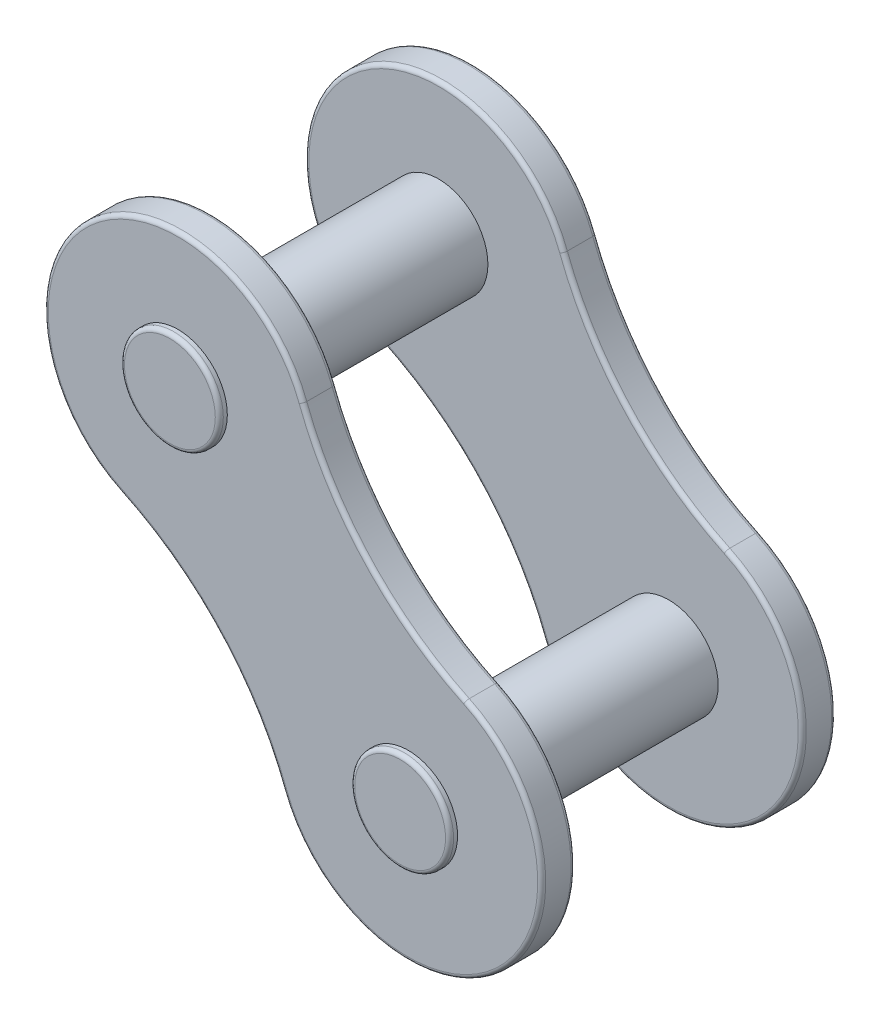
ISO-10303-21;
HEADER;
FILE_DESCRIPTION(('STEP AP214'),'2;1');
FILE_NAME('part.step','',(''),(''),'','','');
FILE_SCHEMA(('AUTOMOTIVE_DESIGN { 1 0 10303 214 1 1 1 1 }'));
ENDSEC;
DATA;
#1=APPLICATION_CONTEXT('core data for automotive mechanical design processes');
#2=APPLICATION_PROTOCOL_DEFINITION('international standard','automotive_design',2000,#1);
#3=PRODUCT_CONTEXT('',#1,'mechanical');
#4=PRODUCT('Part','Part','',(#3));
#5=PRODUCT_RELATED_PRODUCT_CATEGORY('part','',(#4));
#6=PRODUCT_DEFINITION_FORMATION('','',#4);
#7=PRODUCT_DEFINITION_CONTEXT('part definition',#1,'design');
#8=PRODUCT_DEFINITION('design','',#6,#7);
#9=PRODUCT_DEFINITION_SHAPE('','',#8);
#10=(LENGTH_UNIT() NAMED_UNIT(*) SI_UNIT(.MILLI.,.METRE.));
#11=(NAMED_UNIT(*) PLANE_ANGLE_UNIT() SI_UNIT($,.RADIAN.));
#12=(NAMED_UNIT(*) SI_UNIT($,.STERADIAN.) SOLID_ANGLE_UNIT());
#13=UNCERTAINTY_MEASURE_WITH_UNIT(LENGTH_MEASURE(1.E-05),#10,'distance_accuracy_value','');
#14=(GEOMETRIC_REPRESENTATION_CONTEXT(3) GLOBAL_UNCERTAINTY_ASSIGNED_CONTEXT((#13)) GLOBAL_UNIT_ASSIGNED_CONTEXT((#10,
#11,#12)) REPRESENTATION_CONTEXT('',''));
#15=CARTESIAN_POINT('',(0.,0.,0.));
#16=DIRECTION('',(0.,0.,1.));
#17=DIRECTION('',(1.,0.,0.));
#18=AXIS2_PLACEMENT_3D('',#15,#16,#17);
#19=CARTESIAN_POINT('',(26.9319694595818,-25.4507928486215,5.5));
#20=DIRECTION('',(0.,0.,1.));
#21=DIRECTION('',(1.,0.,0.));
#22=AXIS2_PLACEMENT_3D('',#19,#20,#21);
#23=PLANE('',#22);
#24=CARTESIAN_POINT('',(23.2925043090767,-33.1322180691296,5.5));
#25=DIRECTION('',(0.,0.,1.));
#26=DIRECTION('',(1.,0.,0.));
#27=AXIS2_PLACEMENT_3D('',#24,#25,#26);
#28=CIRCLE('',#27,12.15);
#29=CARTESIAN_POINT('',(28.4947986124458,-22.1522984892268,5.5));
#30=VERTEX_POINT('',#29);
#31=CARTESIAN_POINT('',(34.6520311444618,-28.8213422792041,5.5));
#32=VERTEX_POINT('',#31);
#33=EDGE_CURVE('E245',#30,#32,#28,.F.);
#34=ORIENTED_EDGE('',*,*,#33,.T.);
#35=CARTESIAN_POINT('',(39.1864924738131,-27.1005400091516,5.5));
#36=DIRECTION('',(0.,0.,1.));
#37=DIRECTION('',(1.,0.,0.));
#38=AXIS2_PLACEMENT_3D('',#35,#36,#37);
#39=CIRCLE('',#38,4.85);
#40=CARTESIAN_POINT('',(41.2631284714542,-22.7176091480381,5.5));
#41=VERTEX_POINT('',#40);
#42=EDGE_CURVE('E248',#32,#41,#39,.T.);
#43=ORIENTED_EDGE('',*,*,#42,.T.);
#44=CARTESIAN_POINT('',(46.4654227748233,-11.7376895681353,5.5));
#45=DIRECTION('',(0.,0.,1.));
#46=DIRECTION('',(1.,0.,0.));
#47=AXIS2_PLACEMENT_3D('',#44,#45,#46);
#48=CIRCLE('',#47,12.15);
#49=CARTESIAN_POINT('',(35.1058959394382,-16.0485653580608,5.5));
#50=VERTEX_POINT('',#49);
#51=EDGE_CURVE('E239',#41,#50,#48,.F.);
#52=ORIENTED_EDGE('',*,*,#51,.T.);
#53=CARTESIAN_POINT('',(30.571434610087,-17.7693676281133,5.5));
#54=DIRECTION('',(0.,0.,1.));
#55=DIRECTION('',(1.,0.,0.));
#56=AXIS2_PLACEMENT_3D('',#53,#54,#55);
#57=CIRCLE('',#56,4.85);
#58=EDGE_CURVE('E242',#50,#30,#57,.T.);
#59=ORIENTED_EDGE('',*,*,#58,.T.);
#60=EDGE_LOOP('',(#34,#43,#52,#59));
#61=FACE_BOUND('',#60,.T.);
#62=CARTESIAN_POINT('',(30.571434610087,-17.7693676281133,5.5));
#63=DIRECTION('',(0.,0.,1.));
#64=DIRECTION('',(1.,0.,0.));
#65=AXIS2_PLACEMENT_3D('',#62,#63,#64);
#66=CIRCLE('',#65,1.85);
#67=CARTESIAN_POINT('',(32.421434610087,-17.7693676281133,5.5));
#68=VERTEX_POINT('',#67);
#69=EDGE_CURVE('E406',#68,#68,#66,.T.);
#70=ORIENTED_EDGE('',*,*,#69,.F.);
#71=EDGE_LOOP('',(#70));
#72=FACE_BOUND('',#71,.T.);
#73=CARTESIAN_POINT('',(39.1864924738131,-27.1005400091516,5.5));
#74=DIRECTION('',(0.,0.,1.));
#75=DIRECTION('',(1.,0.,0.));
#76=AXIS2_PLACEMENT_3D('',#73,#74,#75);
#77=CIRCLE('',#76,1.85);
#78=CARTESIAN_POINT('',(41.0364924738131,-27.1005400091516,5.5));
#79=VERTEX_POINT('',#78);
#80=EDGE_CURVE('E429',#79,#79,#77,.T.);
#81=ORIENTED_EDGE('',*,*,#80,.F.);
#82=EDGE_LOOP('',(#81));
#83=FACE_BOUND('',#82,.T.);
#84=ADVANCED_FACE('F41',(#61,#72,#83),#23,.T.);
#85=CARTESIAN_POINT('',(26.9319694595818,-25.4507928486215,4.25));
#86=DIRECTION('',(0.,0.,1.));
#87=DIRECTION('',(1.,0.,0.));
#88=AXIS2_PLACEMENT_3D('',#85,#86,#87);
#89=PLANE('',#88);
#90=CARTESIAN_POINT('',(46.4654227748233,-11.7376895681353,4.25));
#91=DIRECTION('',(0.,0.,1.));
#92=DIRECTION('',(1.,0.,0.));
#93=AXIS2_PLACEMENT_3D('',#90,#91,#92);
#94=CIRCLE('',#93,12.15);
#95=CARTESIAN_POINT('',(35.1058959394382,-16.0485653580608,4.25));
#96=VERTEX_POINT('',#95);
#97=CARTESIAN_POINT('',(41.2631284714542,-22.7176091480381,4.25));
#98=VERTEX_POINT('',#97);
#99=EDGE_CURVE('E272',#96,#98,#94,.T.);
#100=ORIENTED_EDGE('',*,*,#99,.T.);
#101=CARTESIAN_POINT('',(39.1864924738131,-27.1005400091516,4.25));
#102=DIRECTION('',(0.,0.,1.));
#103=DIRECTION('',(1.,0.,0.));
#104=AXIS2_PLACEMENT_3D('',#101,#102,#103);
#105=CIRCLE('',#104,4.85);
#106=CARTESIAN_POINT('',(34.6520311444618,-28.8213422792041,4.25));
#107=VERTEX_POINT('',#106);
#108=EDGE_CURVE('E280',#98,#107,#105,.F.);
#109=ORIENTED_EDGE('',*,*,#108,.T.);
#110=CARTESIAN_POINT('',(23.2925043090767,-33.1322180691296,4.25));
#111=DIRECTION('',(0.,0.,1.));
#112=DIRECTION('',(1.,0.,0.));
#113=AXIS2_PLACEMENT_3D('',#110,#111,#112);
#114=CIRCLE('',#113,12.15);
#115=CARTESIAN_POINT('',(28.4947986124458,-22.1522984892268,4.25));
#116=VERTEX_POINT('',#115);
#117=EDGE_CURVE('E66',#107,#116,#114,.T.);
#118=ORIENTED_EDGE('',*,*,#117,.T.);
#119=CARTESIAN_POINT('',(30.571434610087,-17.7693676281133,4.25));
#120=DIRECTION('',(0.,0.,1.));
#121=DIRECTION('',(1.,0.,0.));
#122=AXIS2_PLACEMENT_3D('',#119,#120,#121);
#123=CIRCLE('',#122,4.85);
#124=EDGE_CURVE('E275',#116,#96,#123,.F.);
#125=ORIENTED_EDGE('',*,*,#124,.T.);
#126=EDGE_LOOP('',(#100,#109,#118,#125));
#127=FACE_BOUND('',#126,.T.);
#128=CARTESIAN_POINT('',(30.571434610087,-17.7693676281133,4.25));
#129=DIRECTION('',(0.,0.,1.));
#130=DIRECTION('',(1.,0.,0.));
#131=AXIS2_PLACEMENT_3D('',#128,#129,#130);
#132=CIRCLE('',#131,1.85);
#133=CARTESIAN_POINT('',(32.421434610087,-17.7693676281133,4.25));
#134=VERTEX_POINT('',#133);
#135=EDGE_CURVE('E482',#134,#134,#132,.T.);
#136=ORIENTED_EDGE('',*,*,#135,.T.);
#137=EDGE_LOOP('',(#136));
#138=FACE_BOUND('',#137,.T.);
#139=CARTESIAN_POINT('',(39.1864924738131,-27.1005400091516,4.25));
#140=DIRECTION('',(0.,0.,1.));
#141=DIRECTION('',(1.,0.,0.));
#142=AXIS2_PLACEMENT_3D('',#139,#140,#141);
#143=CIRCLE('',#142,1.85);
#144=CARTESIAN_POINT('',(41.0364924738131,-27.1005400091516,4.25));
#145=VERTEX_POINT('',#144);
#146=EDGE_CURVE('E426',#145,#145,#143,.T.);
#147=ORIENTED_EDGE('',*,*,#146,.T.);
#148=EDGE_LOOP('',(#147));
#149=FACE_BOUND('',#148,.T.);
#150=ADVANCED_FACE('F380',(#127,#138,#149),#89,.F.);
#151=CARTESIAN_POINT('',(30.571434610087,-17.7693676281133,5.5));
#152=DIRECTION('',(0.,0.,-1.));
#153=DIRECTION('',(-1.,0.,0.));
#154=AXIS2_PLACEMENT_3D('',#151,#152,#153);
#155=CYLINDRICAL_SURFACE('',#154,5.);
#156=DIRECTION('',(0.,0.,-1.));
#157=VECTOR('',#156,1.);
#158=CARTESIAN_POINT('',(28.4305727568486,-22.2878530519417,5.5));
#159=LINE('',#158,#157);
#160=CARTESIAN_POINT('',(28.4305727568486,-22.2878530519417,5.35));
#161=VERTEX_POINT('',#160);
#162=CARTESIAN_POINT('',(28.4305727568486,-22.2878530519417,4.4));
#163=VERTEX_POINT('',#162);
#164=EDGE_CURVE('E404',#161,#163,#159,.T.);
#165=ORIENTED_EDGE('',*,*,#164,.F.);
#166=CARTESIAN_POINT('',(30.571434610087,-17.7693676281133,5.35));
#167=DIRECTION('',(0.,0.,1.));
#168=DIRECTION('',(1.,0.,0.));
#169=AXIS2_PLACEMENT_3D('',#166,#167,#168);
#170=CIRCLE('',#169,5.);
#171=CARTESIAN_POINT('',(35.24613701148,-15.9953446692963,5.35));
#172=VERTEX_POINT('',#171);
#173=EDGE_CURVE('E269',#161,#172,#170,.F.);
#174=ORIENTED_EDGE('',*,*,#173,.T.);
#175=DIRECTION('',(0.,0.,-1.));
#176=VECTOR('',#175,1.);
#177=CARTESIAN_POINT('',(35.24613701148,-15.9953446692963,5.5));
#178=LINE('',#177,#176);
#179=CARTESIAN_POINT('',(35.24613701148,-15.9953446692963,4.4));
#180=VERTEX_POINT('',#179);
#181=EDGE_CURVE('E400',#172,#180,#178,.T.);
#182=ORIENTED_EDGE('',*,*,#181,.T.);
#183=CARTESIAN_POINT('',(30.571434610087,-17.7693676281133,4.4));
#184=DIRECTION('',(0.,0.,1.));
#185=DIRECTION('',(1.,0.,0.));
#186=AXIS2_PLACEMENT_3D('',#183,#184,#185);
#187=CIRCLE('',#186,5.);
#188=EDGE_CURVE('E266',#180,#163,#187,.T.);
#189=ORIENTED_EDGE('',*,*,#188,.T.);
#190=EDGE_LOOP('',(#165,#174,#182,#189));
#191=FACE_BOUND('',#190,.T.);
#192=ADVANCED_FACE('F787',(#191),#155,.T.);
#193=CARTESIAN_POINT('',(23.2925043090767,-33.1322180691296,5.5));
#194=DIRECTION('',(0.,0.,-1.));
#195=DIRECTION('',(-1.,0.,0.));
#196=AXIS2_PLACEMENT_3D('',#193,#194,#195);
#197=CYLINDRICAL_SURFACE('',#196,12.);
#198=DIRECTION('',(0.,0.,-1.));
#199=VECTOR('',#198,1.);
#200=CARTESIAN_POINT('',(34.51179007242,-28.8745629679687,5.5));
#201=LINE('',#200,#199);
#202=CARTESIAN_POINT('',(34.51179007242,-28.8745629679687,5.35));
#203=VERTEX_POINT('',#202);
#204=CARTESIAN_POINT('',(34.51179007242,-28.8745629679687,4.4));
#205=VERTEX_POINT('',#204);
#206=EDGE_CURVE('E396',#203,#205,#201,.T.);
#207=ORIENTED_EDGE('',*,*,#206,.F.);
#208=CARTESIAN_POINT('',(23.2925043090767,-33.1322180691296,5.35));
#209=DIRECTION('',(0.,0.,1.));
#210=DIRECTION('',(1.,0.,0.));
#211=AXIS2_PLACEMENT_3D('',#208,#209,#210);
#212=CIRCLE('',#211,12.);
#213=EDGE_CURVE('E263',#203,#161,#212,.T.);
#214=ORIENTED_EDGE('',*,*,#213,.T.);
#215=ORIENTED_EDGE('',*,*,#164,.T.);
#216=CARTESIAN_POINT('',(23.2925043090767,-33.1322180691296,4.4));
#217=DIRECTION('',(0.,0.,1.));
#218=DIRECTION('',(1.,0.,0.));
#219=AXIS2_PLACEMENT_3D('',#216,#217,#218);
#220=CIRCLE('',#219,12.);
#221=EDGE_CURVE('E260',#163,#205,#220,.F.);
#222=ORIENTED_EDGE('',*,*,#221,.T.);
#223=EDGE_LOOP('',(#207,#214,#215,#222));
#224=FACE_BOUND('',#223,.T.);
#225=ADVANCED_FACE('F790',(#224),#197,.F.);
#226=CARTESIAN_POINT('',(39.1864924738131,-27.1005400091516,5.5));
#227=DIRECTION('',(0.,0.,-1.));
#228=DIRECTION('',(-1.,0.,0.));
#229=AXIS2_PLACEMENT_3D('',#226,#227,#228);
#230=CYLINDRICAL_SURFACE('',#229,5.);
#231=DIRECTION('',(0.,0.,-1.));
#232=VECTOR('',#231,1.);
#233=CARTESIAN_POINT('',(41.3273543270514,-22.5820545853233,5.5));
#234=LINE('',#233,#232);
#235=CARTESIAN_POINT('',(41.3273543270514,-22.5820545853233,5.35));
#236=VERTEX_POINT('',#235);
#237=CARTESIAN_POINT('',(41.3273543270514,-22.5820545853233,4.4));
#238=VERTEX_POINT('',#237);
#239=EDGE_CURVE('E393',#236,#238,#234,.T.);
#240=ORIENTED_EDGE('',*,*,#239,.F.);
#241=CARTESIAN_POINT('',(39.1864924738131,-27.1005400091516,5.35));
#242=DIRECTION('',(0.,0.,1.));
#243=DIRECTION('',(1.,0.,0.));
#244=AXIS2_PLACEMENT_3D('',#241,#242,#243);
#245=CIRCLE('',#244,5.);
#246=EDGE_CURVE('E256',#236,#203,#245,.F.);
#247=ORIENTED_EDGE('',*,*,#246,.T.);
#248=ORIENTED_EDGE('',*,*,#206,.T.);
#249=CARTESIAN_POINT('',(39.1864924738131,-27.1005400091516,4.4));
#250=DIRECTION('',(0.,0.,1.));
#251=DIRECTION('',(1.,0.,0.));
#252=AXIS2_PLACEMENT_3D('',#249,#250,#251);
#253=CIRCLE('',#252,5.);
#254=EDGE_CURVE('E252',#205,#238,#253,.T.);
#255=ORIENTED_EDGE('',*,*,#254,.T.);
#256=EDGE_LOOP('',(#240,#247,#248,#255));
#257=FACE_BOUND('',#256,.T.);
#258=ADVANCED_FACE('F392',(#257),#230,.T.);
#259=CARTESIAN_POINT('',(46.4654227748233,-11.7376895681353,5.5));
#260=DIRECTION('',(0.,0.,-1.));
#261=DIRECTION('',(-1.,0.,0.));
#262=AXIS2_PLACEMENT_3D('',#259,#260,#261);
#263=CYLINDRICAL_SURFACE('',#262,12.);
#264=ORIENTED_EDGE('',*,*,#181,.F.);
#265=CARTESIAN_POINT('',(46.4654227748233,-11.7376895681353,5.35));
#266=DIRECTION('',(0.,0.,1.));
#267=DIRECTION('',(1.,0.,0.));
#268=AXIS2_PLACEMENT_3D('',#265,#266,#267);
#269=CIRCLE('',#268,12.);
#270=EDGE_CURVE('E11',#172,#236,#269,.T.);
#271=ORIENTED_EDGE('',*,*,#270,.T.);
#272=ORIENTED_EDGE('',*,*,#239,.T.);
#273=CARTESIAN_POINT('',(46.4654227748233,-11.7376895681353,4.4));
#274=DIRECTION('',(0.,0.,1.));
#275=DIRECTION('',(1.,0.,0.));
#276=AXIS2_PLACEMENT_3D('',#273,#274,#275);
#277=CIRCLE('',#276,12.);
#278=EDGE_CURVE('E51',#238,#180,#277,.F.);
#279=ORIENTED_EDGE('',*,*,#278,.T.);
#280=EDGE_LOOP('',(#264,#271,#272,#279));
#281=FACE_BOUND('',#280,.T.);
#282=ADVANCED_FACE('F397',(#281),#263,.F.);
#283=CARTESIAN_POINT('',(39.1864924738131,-27.1005400091516,-5.8));
#284=DIRECTION('',(0.,0.,1.));
#285=DIRECTION('',(1.,0.,0.));
#286=AXIS2_PLACEMENT_3D('',#283,#284,#285);
#287=CYLINDRICAL_SURFACE('',#286,1.85);
#288=CARTESIAN_POINT('',(39.1864924738131,-27.1005400091516,-4.25));
#289=DIRECTION('',(0.,0.,1.));
#290=DIRECTION('',(1.,0.,0.));
#291=AXIS2_PLACEMENT_3D('',#288,#289,#290);
#292=CIRCLE('',#291,1.85);
#293=CARTESIAN_POINT('',(41.0364924738131,-27.1005400091516,-4.25));
#294=VERTEX_POINT('',#293);
#295=EDGE_CURVE('E208',#294,#294,#292,.F.);
#296=ORIENTED_EDGE('',*,*,#295,.F.);
#297=EDGE_LOOP('',(#296));
#298=FACE_BOUND('',#297,.T.);
#299=ORIENTED_EDGE('',*,*,#146,.F.);
#300=EDGE_LOOP('',(#299));
#301=FACE_BOUND('',#300,.T.);
#302=ADVANCED_FACE('F418',(#298,#301),#287,.T.);
#303=CARTESIAN_POINT('',(39.1864924738131,-27.1005400091516,5.65));
#304=DIRECTION('',(0.,0.,1.));
#305=DIRECTION('',(1.,0.,0.));
#306=AXIS2_PLACEMENT_3D('',#303,#304,#305);
#307=CIRCLE('',#306,1.85);
#308=CARTESIAN_POINT('',(41.0364924738131,-27.1005400091516,5.65));
#309=VERTEX_POINT('',#308);
#310=EDGE_CURVE('E309',#309,#309,#307,.F.);
#311=ORIENTED_EDGE('',*,*,#310,.T.);
#312=EDGE_LOOP('',(#311));
#313=FACE_BOUND('',#312,.T.);
#314=ORIENTED_EDGE('',*,*,#80,.T.);
#315=EDGE_LOOP('',(#314));
#316=FACE_BOUND('',#315,.T.);
#317=ADVANCED_FACE('F421',(#313,#316),#287,.T.);
#318=CARTESIAN_POINT('',(39.1864924738131,-27.1005400091516,5.8));
#319=DIRECTION('',(0.,0.,1.));
#320=DIRECTION('',(1.,0.,0.));
#321=AXIS2_PLACEMENT_3D('',#318,#319,#320);
#322=PLANE('',#321);
#323=CARTESIAN_POINT('',(39.1864924738131,-27.1005400091516,5.8));
#324=DIRECTION('',(0.,0.,1.));
#325=DIRECTION('',(1.,0.,0.));
#326=AXIS2_PLACEMENT_3D('',#323,#324,#325);
#327=CIRCLE('',#326,1.7);
#328=CARTESIAN_POINT('',(40.8864924738131,-27.1005400091516,5.8));
#329=VERTEX_POINT('',#328);
#330=EDGE_CURVE('E305',#329,#329,#327,.T.);
#331=ORIENTED_EDGE('',*,*,#330,.T.);
#332=EDGE_LOOP('',(#331));
#333=FACE_BOUND('',#332,.T.);
#334=ADVANCED_FACE('F451',(#333),#322,.T.);
#335=CARTESIAN_POINT('',(23.2925043090767,-33.1322180691296,-5.5));
#336=DIRECTION('',(0.,0.,1.));
#337=DIRECTION('',(1.,0.,0.));
#338=AXIS2_PLACEMENT_3D('',#335,#336,#337);
#339=CYLINDRICAL_SURFACE('',#338,12.);
#340=DIRECTION('',(0.,0.,1.));
#341=VECTOR('',#340,1.);
#342=CARTESIAN_POINT('',(28.4305727568486,-22.2878530519416,-5.5));
#343=LINE('',#342,#341);
#344=CARTESIAN_POINT('',(28.4305727568486,-22.2878530519416,-5.35));
#345=VERTEX_POINT('',#344);
#346=CARTESIAN_POINT('',(28.4305727568486,-22.2878530519416,-4.4));
#347=VERTEX_POINT('',#346);
#348=EDGE_CURVE('E164',#345,#347,#343,.T.);
#349=ORIENTED_EDGE('',*,*,#348,.F.);
#350=CARTESIAN_POINT('',(23.2925043090767,-33.1322180691296,-5.35));
#351=DIRECTION('',(0.,0.,1.));
#352=DIRECTION('',(1.,0.,0.));
#353=AXIS2_PLACEMENT_3D('',#350,#351,#352);
#354=CIRCLE('',#353,12.);
#355=CARTESIAN_POINT('',(34.51179007242,-28.8745629679687,-5.35));
#356=VERTEX_POINT('',#355);
#357=EDGE_CURVE('E159',#345,#356,#354,.F.);
#358=ORIENTED_EDGE('',*,*,#357,.T.);
#359=DIRECTION('',(0.,0.,1.));
#360=VECTOR('',#359,1.);
#361=CARTESIAN_POINT('',(34.51179007242,-28.8745629679687,-5.5));
#362=LINE('',#361,#360);
#363=CARTESIAN_POINT('',(34.51179007242,-28.8745629679687,-4.4));
#364=VERTEX_POINT('',#363);
#365=EDGE_CURVE('E162',#356,#364,#362,.T.);
#366=ORIENTED_EDGE('',*,*,#365,.T.);
#367=CARTESIAN_POINT('',(23.2925043090767,-33.1322180691296,-4.4));
#368=DIRECTION('',(0.,0.,1.));
#369=DIRECTION('',(1.,0.,0.));
#370=AXIS2_PLACEMENT_3D('',#367,#368,#369);
#371=CIRCLE('',#370,12.);
#372=EDGE_CURVE('E171',#364,#347,#371,.T.);
#373=ORIENTED_EDGE('',*,*,#372,.T.);
#374=EDGE_LOOP('',(#349,#358,#366,#373));
#375=FACE_BOUND('',#374,.T.);
#376=ADVANCED_FACE('F161',(#375),#339,.F.);
#377=CARTESIAN_POINT('',(30.571434610087,-17.7693676281133,-5.5));
#378=DIRECTION('',(0.,0.,1.));
#379=DIRECTION('',(1.,0.,0.));
#380=AXIS2_PLACEMENT_3D('',#377,#378,#379);
#381=CYLINDRICAL_SURFACE('',#380,5.);
#382=DIRECTION('',(0.,0.,1.));
#383=VECTOR('',#382,1.);
#384=CARTESIAN_POINT('',(35.24613701148,-15.9953446692963,-5.5));
#385=LINE('',#384,#383);
#386=CARTESIAN_POINT('',(35.24613701148,-15.9953446692963,-5.35));
#387=VERTEX_POINT('',#386);
#388=CARTESIAN_POINT('',(35.24613701148,-15.9953446692963,-4.4));
#389=VERTEX_POINT('',#388);
#390=EDGE_CURVE('E435',#387,#389,#385,.T.);
#391=ORIENTED_EDGE('',*,*,#390,.F.);
#392=CARTESIAN_POINT('',(30.571434610087,-17.7693676281133,-5.35));
#393=DIRECTION('',(0.,0.,1.));
#394=DIRECTION('',(1.,0.,0.));
#395=AXIS2_PLACEMENT_3D('',#392,#393,#394);
#396=CIRCLE('',#395,5.);
#397=EDGE_CURVE('E223',#387,#345,#396,.T.);
#398=ORIENTED_EDGE('',*,*,#397,.T.);
#399=ORIENTED_EDGE('',*,*,#348,.T.);
#400=CARTESIAN_POINT('',(30.571434610087,-17.7693676281133,-4.4));
#401=DIRECTION('',(0.,0.,1.));
#402=DIRECTION('',(1.,0.,0.));
#403=AXIS2_PLACEMENT_3D('',#400,#401,#402);
#404=CIRCLE('',#403,5.);
#405=EDGE_CURVE('E170',#347,#389,#404,.F.);
#406=ORIENTED_EDGE('',*,*,#405,.T.);
#407=EDGE_LOOP('',(#391,#398,#399,#406));
#408=FACE_BOUND('',#407,.T.);
#409=ADVANCED_FACE('F511',(#408),#381,.T.);
#410=CARTESIAN_POINT('',(46.4654227748233,-11.7376895681353,-5.5));
#411=DIRECTION('',(0.,0.,1.));
#412=DIRECTION('',(1.,0.,0.));
#413=AXIS2_PLACEMENT_3D('',#410,#411,#412);
#414=CYLINDRICAL_SURFACE('',#413,12.);
#415=DIRECTION('',(0.,0.,1.));
#416=VECTOR('',#415,1.);
#417=CARTESIAN_POINT('',(41.3273543270514,-22.5820545853233,-5.5));
#418=LINE('',#417,#416);
#419=CARTESIAN_POINT('',(41.3273543270514,-22.5820545853233,-5.35));
#420=VERTEX_POINT('',#419);
#421=CARTESIAN_POINT('',(41.3273543270514,-22.5820545853233,-4.4));
#422=VERTEX_POINT('',#421);
#423=EDGE_CURVE('E184',#420,#422,#418,.T.);
#424=ORIENTED_EDGE('',*,*,#423,.F.);
#425=CARTESIAN_POINT('',(46.4654227748233,-11.7376895681353,-5.35));
#426=DIRECTION('',(0.,0.,1.));
#427=DIRECTION('',(1.,0.,0.));
#428=AXIS2_PLACEMENT_3D('',#425,#426,#427);
#429=CIRCLE('',#428,12.);
#430=EDGE_CURVE('E302',#420,#387,#429,.F.);
#431=ORIENTED_EDGE('',*,*,#430,.T.);
#432=ORIENTED_EDGE('',*,*,#390,.T.);
#433=CARTESIAN_POINT('',(46.4654227748233,-11.7376895681353,-4.4));
#434=DIRECTION('',(0.,0.,1.));
#435=DIRECTION('',(1.,0.,0.));
#436=AXIS2_PLACEMENT_3D('',#433,#434,#435);
#437=CIRCLE('',#436,12.);
#438=EDGE_CURVE('E299',#389,#422,#437,.T.);
#439=ORIENTED_EDGE('',*,*,#438,.T.);
#440=EDGE_LOOP('',(#424,#431,#432,#439));
#441=FACE_BOUND('',#440,.T.);
#442=ADVANCED_FACE('F596',(#441),#414,.F.);
#443=CARTESIAN_POINT('',(39.1864924738131,-27.1005400091516,-5.5));
#444=DIRECTION('',(0.,0.,1.));
#445=DIRECTION('',(1.,0.,0.));
#446=AXIS2_PLACEMENT_3D('',#443,#444,#445);
#447=CYLINDRICAL_SURFACE('',#446,5.);
#448=ORIENTED_EDGE('',*,*,#365,.F.);
#449=CARTESIAN_POINT('',(39.1864924738131,-27.1005400091516,-5.35));
#450=DIRECTION('',(0.,0.,1.));
#451=DIRECTION('',(1.,0.,0.));
#452=AXIS2_PLACEMENT_3D('',#449,#450,#451);
#453=CIRCLE('',#452,5.);
#454=EDGE_CURVE('E179',#356,#420,#453,.T.);
#455=ORIENTED_EDGE('',*,*,#454,.T.);
#456=ORIENTED_EDGE('',*,*,#423,.T.);
#457=CARTESIAN_POINT('',(39.1864924738131,-27.1005400091516,-4.4));
#458=DIRECTION('',(0.,0.,1.));
#459=DIRECTION('',(1.,0.,0.));
#460=AXIS2_PLACEMENT_3D('',#457,#458,#459);
#461=CIRCLE('',#460,5.);
#462=EDGE_CURVE('E182',#422,#364,#461,.F.);
#463=ORIENTED_EDGE('',*,*,#462,.T.);
#464=EDGE_LOOP('',(#448,#455,#456,#463));
#465=FACE_BOUND('',#464,.T.);
#466=ADVANCED_FACE('F176',(#465),#447,.T.);
#467=CARTESIAN_POINT('',(26.9319694595818,-25.4507928486215,-5.5));
#468=DIRECTION('',(0.,0.,1.));
#469=DIRECTION('',(1.,0.,0.));
#470=AXIS2_PLACEMENT_3D('',#467,#468,#469);
#471=PLANE('',#470);
#472=CARTESIAN_POINT('',(46.4654227748233,-11.7376895681353,-5.5));
#473=DIRECTION('',(0.,0.,1.));
#474=DIRECTION('',(1.,0.,0.));
#475=AXIS2_PLACEMENT_3D('',#472,#473,#474);
#476=CIRCLE('',#475,12.15);
#477=CARTESIAN_POINT('',(35.1058959394382,-16.0485653580608,-5.5));
#478=VERTEX_POINT('',#477);
#479=CARTESIAN_POINT('',(41.2631284714542,-22.7176091480381,-5.5));
#480=VERTEX_POINT('',#479);
#481=EDGE_CURVE('E202',#478,#480,#476,.T.);
#482=ORIENTED_EDGE('',*,*,#481,.T.);
#483=CARTESIAN_POINT('',(39.1864924738131,-27.1005400091516,-5.5));
#484=DIRECTION('',(0.,0.,1.));
#485=DIRECTION('',(1.,0.,0.));
#486=AXIS2_PLACEMENT_3D('',#483,#484,#485);
#487=CIRCLE('',#486,4.85);
#488=CARTESIAN_POINT('',(34.6520311444618,-28.8213422792041,-5.5));
#489=VERTEX_POINT('',#488);
#490=EDGE_CURVE('E216',#480,#489,#487,.F.);
#491=ORIENTED_EDGE('',*,*,#490,.T.);
#492=CARTESIAN_POINT('',(23.2925043090767,-33.1322180691296,-5.5));
#493=DIRECTION('',(0.,0.,1.));
#494=DIRECTION('',(1.,0.,0.));
#495=AXIS2_PLACEMENT_3D('',#492,#493,#494);
#496=CIRCLE('',#495,12.15);
#497=CARTESIAN_POINT('',(28.4947986124458,-22.1522984892268,-5.5));
#498=VERTEX_POINT('',#497);
#499=EDGE_CURVE('E190',#489,#498,#496,.T.);
#500=ORIENTED_EDGE('',*,*,#499,.T.);
#501=CARTESIAN_POINT('',(30.571434610087,-17.7693676281133,-5.5));
#502=DIRECTION('',(0.,0.,1.));
#503=DIRECTION('',(1.,0.,0.));
#504=AXIS2_PLACEMENT_3D('',#501,#502,#503);
#505=CIRCLE('',#504,4.85);
#506=EDGE_CURVE('E206',#498,#478,#505,.F.);
#507=ORIENTED_EDGE('',*,*,#506,.T.);
#508=EDGE_LOOP('',(#482,#491,#500,#507));
#509=FACE_BOUND('',#508,.T.);
#510=CARTESIAN_POINT('',(30.571434610087,-17.7693676281133,-5.5));
#511=DIRECTION('',(0.,0.,1.));
#512=DIRECTION('',(1.,0.,0.));
#513=AXIS2_PLACEMENT_3D('',#510,#511,#512);
#514=CIRCLE('',#513,1.85);
#515=CARTESIAN_POINT('',(32.421434610087,-17.7693676281133,-5.5));
#516=VERTEX_POINT('',#515);
#517=EDGE_CURVE('E332',#516,#516,#514,.T.);
#518=ORIENTED_EDGE('',*,*,#517,.T.);
#519=EDGE_LOOP('',(#518));
#520=FACE_BOUND('',#519,.T.);
#521=CARTESIAN_POINT('',(39.1864924738131,-27.1005400091516,-5.5));
#522=DIRECTION('',(0.,0.,1.));
#523=DIRECTION('',(1.,0.,0.));
#524=AXIS2_PLACEMENT_3D('',#521,#522,#523);
#525=CIRCLE('',#524,1.85);
#526=CARTESIAN_POINT('',(41.0364924738131,-27.1005400091516,-5.5));
#527=VERTEX_POINT('',#526);
#528=EDGE_CURVE('E185',#527,#527,#525,.T.);
#529=ORIENTED_EDGE('',*,*,#528,.T.);
#530=EDGE_LOOP('',(#529));
#531=FACE_BOUND('',#530,.T.);
#532=ADVANCED_FACE('F588',(#509,#520,#531),#471,.F.);
#533=CARTESIAN_POINT('',(26.9319694595818,-25.4507928486215,-4.25));
#534=DIRECTION('',(0.,0.,1.));
#535=DIRECTION('',(1.,0.,0.));
#536=AXIS2_PLACEMENT_3D('',#533,#534,#535);
#537=PLANE('',#536);
#538=CARTESIAN_POINT('',(23.2925043090767,-33.1322180691296,-4.25));
#539=DIRECTION('',(0.,0.,1.));
#540=DIRECTION('',(1.,0.,0.));
#541=AXIS2_PLACEMENT_3D('',#538,#539,#540);
#542=CIRCLE('',#541,12.15);
#543=CARTESIAN_POINT('',(28.4947986124458,-22.1522984892268,-4.25));
#544=VERTEX_POINT('',#543);
#545=CARTESIAN_POINT('',(34.6520311444618,-28.8213422792041,-4.25));
#546=VERTEX_POINT('',#545);
#547=EDGE_CURVE('E232',#544,#546,#542,.F.);
#548=ORIENTED_EDGE('',*,*,#547,.T.);
#549=CARTESIAN_POINT('',(39.1864924738131,-27.1005400091516,-4.25));
#550=DIRECTION('',(0.,0.,1.));
#551=DIRECTION('',(1.,0.,0.));
#552=AXIS2_PLACEMENT_3D('',#549,#550,#551);
#553=CIRCLE('',#552,4.85);
#554=CARTESIAN_POINT('',(41.2631284714542,-22.7176091480381,-4.25));
#555=VERTEX_POINT('',#554);
#556=EDGE_CURVE('E235',#546,#555,#553,.T.);
#557=ORIENTED_EDGE('',*,*,#556,.T.);
#558=CARTESIAN_POINT('',(46.4654227748233,-11.7376895681353,-4.25));
#559=DIRECTION('',(0.,0.,1.));
#560=DIRECTION('',(1.,0.,0.));
#561=AXIS2_PLACEMENT_3D('',#558,#559,#560);
#562=CIRCLE('',#561,12.15);
#563=CARTESIAN_POINT('',(35.1058959394382,-16.0485653580608,-4.25));
#564=VERTEX_POINT('',#563);
#565=EDGE_CURVE('E226',#555,#564,#562,.F.);
#566=ORIENTED_EDGE('',*,*,#565,.T.);
#567=CARTESIAN_POINT('',(30.571434610087,-17.7693676281133,-4.25));
#568=DIRECTION('',(0.,0.,1.));
#569=DIRECTION('',(1.,0.,0.));
#570=AXIS2_PLACEMENT_3D('',#567,#568,#569);
#571=CIRCLE('',#570,4.85);
#572=EDGE_CURVE('E229',#564,#544,#571,.T.);
#573=ORIENTED_EDGE('',*,*,#572,.T.);
#574=EDGE_LOOP('',(#548,#557,#566,#573));
#575=FACE_BOUND('',#574,.T.);
#576=CARTESIAN_POINT('',(30.571434610087,-17.7693676281133,-4.25));
#577=DIRECTION('',(0.,0.,1.));
#578=DIRECTION('',(1.,0.,0.));
#579=AXIS2_PLACEMENT_3D('',#576,#577,#578);
#580=CIRCLE('',#579,1.85);
#581=CARTESIAN_POINT('',(32.421434610087,-17.7693676281133,-4.25));
#582=VERTEX_POINT('',#581);
#583=EDGE_CURVE('E478',#582,#582,#580,.T.);
#584=ORIENTED_EDGE('',*,*,#583,.F.);
#585=EDGE_LOOP('',(#584));
#586=FACE_BOUND('',#585,.T.);
#587=ORIENTED_EDGE('',*,*,#295,.T.);
#588=EDGE_LOOP('',(#587));
#589=FACE_BOUND('',#588,.T.);
#590=ADVANCED_FACE('F416',(#575,#586,#589),#537,.T.);
#591=CARTESIAN_POINT('',(39.1864924738131,-27.1005400091516,-5.8));
#592=DIRECTION('',(0.,0.,1.));
#593=DIRECTION('',(1.,0.,0.));
#594=AXIS2_PLACEMENT_3D('',#591,#592,#593);
#595=PLANE('',#594);
#596=CARTESIAN_POINT('',(39.1864924738131,-27.1005400091516,-5.8));
#597=DIRECTION('',(0.,0.,1.));
#598=DIRECTION('',(1.,0.,0.));
#599=AXIS2_PLACEMENT_3D('',#596,#597,#598);
#600=CIRCLE('',#599,1.7);
#601=CARTESIAN_POINT('',(40.8864924738131,-27.1005400091516,-5.8));
#602=VERTEX_POINT('',#601);
#603=EDGE_CURVE('E287',#602,#602,#600,.F.);
#604=ORIENTED_EDGE('',*,*,#603,.T.);
#605=EDGE_LOOP('',(#604));
#606=FACE_BOUND('',#605,.T.);
#607=ADVANCED_FACE('F461',(#606),#595,.F.);
#608=CARTESIAN_POINT('',(39.1864924738131,-27.1005400091516,-5.65));
#609=DIRECTION('',(0.,0.,1.));
#610=DIRECTION('',(1.,0.,0.));
#611=AXIS2_PLACEMENT_3D('',#608,#609,#610);
#612=CIRCLE('',#611,1.85);
#613=CARTESIAN_POINT('',(41.0364924738131,-27.1005400091516,-5.65));
#614=VERTEX_POINT('',#613);
#615=EDGE_CURVE('E283',#614,#614,#612,.T.);
#616=ORIENTED_EDGE('',*,*,#615,.T.);
#617=EDGE_LOOP('',(#616));
#618=FACE_BOUND('',#617,.T.);
#619=ORIENTED_EDGE('',*,*,#528,.F.);
#620=EDGE_LOOP('',(#619));
#621=FACE_BOUND('',#620,.T.);
#622=ADVANCED_FACE('F423',(#618,#621),#287,.T.);
#623=CARTESIAN_POINT('',(30.571434610087,-17.7693676281133,-5.8));
#624=DIRECTION('',(0.,0.,1.));
#625=DIRECTION('',(1.,0.,0.));
#626=AXIS2_PLACEMENT_3D('',#623,#624,#625);
#627=CYLINDRICAL_SURFACE('',#626,1.85);
#628=ORIENTED_EDGE('',*,*,#583,.T.);
#629=EDGE_LOOP('',(#628));
#630=FACE_BOUND('',#629,.T.);
#631=ORIENTED_EDGE('',*,*,#135,.F.);
#632=EDGE_LOOP('',(#631));
#633=FACE_BOUND('',#632,.T.);
#634=ADVANCED_FACE('F460',(#630,#633),#627,.T.);
#635=CARTESIAN_POINT('',(30.571434610087,-17.7693676281133,-5.8));
#636=DIRECTION('',(0.,0.,1.));
#637=DIRECTION('',(1.,0.,0.));
#638=AXIS2_PLACEMENT_3D('',#635,#636,#637);
#639=PLANE('',#638);
#640=CARTESIAN_POINT('',(30.571434610087,-17.7693676281133,-5.8));
#641=DIRECTION('',(0.,0.,1.));
#642=DIRECTION('',(1.,0.,0.));
#643=AXIS2_PLACEMENT_3D('',#640,#641,#642);
#644=CIRCLE('',#643,1.7);
#645=CARTESIAN_POINT('',(32.271434610087,-17.7693676281133,-5.8));
#646=VERTEX_POINT('',#645);
#647=EDGE_CURVE('E295',#646,#646,#644,.F.);
#648=ORIENTED_EDGE('',*,*,#647,.T.);
#649=EDGE_LOOP('',(#648));
#650=FACE_BOUND('',#649,.T.);
#651=ADVANCED_FACE('F467',(#650),#639,.F.);
#652=CARTESIAN_POINT('',(30.571434610087,-17.7693676281133,-5.65));
#653=DIRECTION('',(0.,0.,1.));
#654=DIRECTION('',(1.,0.,0.));
#655=AXIS2_PLACEMENT_3D('',#652,#653,#654);
#656=CIRCLE('',#655,1.85);
#657=CARTESIAN_POINT('',(32.421434610087,-17.7693676281133,-5.65));
#658=VERTEX_POINT('',#657);
#659=EDGE_CURVE('E291',#658,#658,#656,.T.);
#660=ORIENTED_EDGE('',*,*,#659,.T.);
#661=EDGE_LOOP('',(#660));
#662=FACE_BOUND('',#661,.T.);
#663=ORIENTED_EDGE('',*,*,#517,.F.);
#664=EDGE_LOOP('',(#663));
#665=FACE_BOUND('',#664,.T.);
#666=ADVANCED_FACE('F470',(#662,#665),#627,.T.);
#667=CARTESIAN_POINT('',(30.571434610087,-17.7693676281133,5.65));
#668=DIRECTION('',(0.,0.,1.));
#669=DIRECTION('',(1.,0.,0.));
#670=AXIS2_PLACEMENT_3D('',#667,#668,#669);
#671=CIRCLE('',#670,1.85);
#672=CARTESIAN_POINT('',(32.421434610087,-17.7693676281133,5.65));
#673=VERTEX_POINT('',#672);
#674=EDGE_CURVE('E317',#673,#673,#671,.F.);
#675=ORIENTED_EDGE('',*,*,#674,.T.);
#676=EDGE_LOOP('',(#675));
#677=FACE_BOUND('',#676,.T.);
#678=ORIENTED_EDGE('',*,*,#69,.T.);
#679=EDGE_LOOP('',(#678));
#680=FACE_BOUND('',#679,.T.);
#681=ADVANCED_FACE('F442',(#677,#680),#627,.T.);
#682=CARTESIAN_POINT('',(30.571434610087,-17.7693676281133,5.8));
#683=DIRECTION('',(0.,0.,1.));
#684=DIRECTION('',(1.,0.,0.));
#685=AXIS2_PLACEMENT_3D('',#682,#683,#684);
#686=PLANE('',#685);
#687=CARTESIAN_POINT('',(30.571434610087,-17.7693676281133,5.8));
#688=DIRECTION('',(0.,0.,1.));
#689=DIRECTION('',(1.,0.,0.));
#690=AXIS2_PLACEMENT_3D('',#687,#688,#689);
#691=CIRCLE('',#690,1.7);
#692=CARTESIAN_POINT('',(32.271434610087,-17.7693676281133,5.8));
#693=VERTEX_POINT('',#692);
#694=EDGE_CURVE('E313',#693,#693,#691,.T.);
#695=ORIENTED_EDGE('',*,*,#694,.T.);
#696=EDGE_LOOP('',(#695));
#697=FACE_BOUND('',#696,.T.);
#698=ADVANCED_FACE('F573',(#697),#686,.T.);
#699=CARTESIAN_POINT('',(30.571434610087,-17.7693676281133,-5.35));
#700=DIRECTION('',(0.,0.,1.));
#701=DIRECTION('',(1.,0.,0.));
#702=AXIS2_PLACEMENT_3D('',#699,#700,#701);
#703=TOROIDAL_SURFACE('',#702,4.85,0.15);
#704=CARTESIAN_POINT('',(35.1058959394382,-16.0485653580608,-5.35));
#705=DIRECTION('',(0.354804591763431,-0.934940480278603,0.));
#706=DIRECTION('',(0.934940480278603,0.354804591763431,0.));
#707=AXIS2_PLACEMENT_3D('',#704,#705,#706);
#708=CIRCLE('',#707,0.15);
#709=EDGE_CURVE('E195',#478,#387,#708,.T.);
#710=ORIENTED_EDGE('',*,*,#709,.F.);
#711=ORIENTED_EDGE('',*,*,#506,.F.);
#712=CARTESIAN_POINT('',(28.4947986124458,-22.1522984892268,-5.35));
#713=DIRECTION('',(0.903697084765664,-0.428172370647664,0.));
#714=DIRECTION('',(0.428172370647664,0.903697084765664,0.));
#715=AXIS2_PLACEMENT_3D('',#712,#713,#714);
#716=CIRCLE('',#715,0.15);
#717=EDGE_CURVE('E329',#345,#498,#716,.T.);
#718=ORIENTED_EDGE('',*,*,#717,.F.);
#719=ORIENTED_EDGE('',*,*,#397,.F.);
#720=EDGE_LOOP('',(#710,#711,#718,#719));
#721=FACE_BOUND('',#720,.T.);
#722=ADVANCED_FACE('F575',(#721),#703,.T.);
#723=CARTESIAN_POINT('',(23.2925043090767,-33.1322180691296,-5.35));
#724=DIRECTION('',(0.,0.,1.));
#725=DIRECTION('',(1.,0.,0.));
#726=AXIS2_PLACEMENT_3D('',#723,#724,#725);
#727=TOROIDAL_SURFACE('',#726,12.15,0.15);
#728=ORIENTED_EDGE('',*,*,#717,.T.);
#729=ORIENTED_EDGE('',*,*,#499,.F.);
#730=CARTESIAN_POINT('',(34.6520311444618,-28.8213422792041,-5.35));
#731=DIRECTION('',(0.354804591763431,-0.934940480278603,0.));
#732=DIRECTION('',(0.934940480278603,0.354804591763431,0.));
#733=AXIS2_PLACEMENT_3D('',#730,#731,#732);
#734=CIRCLE('',#733,0.15);
#735=EDGE_CURVE('E188',#356,#489,#734,.T.);
#736=ORIENTED_EDGE('',*,*,#735,.F.);
#737=ORIENTED_EDGE('',*,*,#357,.F.);
#738=EDGE_LOOP('',(#728,#729,#736,#737));
#739=FACE_BOUND('',#738,.T.);
#740=ADVANCED_FACE('F189',(#739),#727,.T.);
#741=CARTESIAN_POINT('',(46.4654227748233,-11.7376895681353,-5.35));
#742=DIRECTION('',(0.,0.,1.));
#743=DIRECTION('',(1.,0.,0.));
#744=AXIS2_PLACEMENT_3D('',#741,#742,#743);
#745=TOROIDAL_SURFACE('',#744,12.15,0.15);
#746=ORIENTED_EDGE('',*,*,#709,.T.);
#747=ORIENTED_EDGE('',*,*,#430,.F.);
#748=CARTESIAN_POINT('',(41.2631284714542,-22.7176091480381,-5.35));
#749=DIRECTION('',(0.903697084765664,-0.428172370647664,0.));
#750=DIRECTION('',(0.428172370647664,0.903697084765664,0.));
#751=AXIS2_PLACEMENT_3D('',#748,#749,#750);
#752=CIRCLE('',#751,0.15);
#753=EDGE_CURVE('E196',#480,#420,#752,.T.);
#754=ORIENTED_EDGE('',*,*,#753,.F.);
#755=ORIENTED_EDGE('',*,*,#481,.F.);
#756=EDGE_LOOP('',(#746,#747,#754,#755));
#757=FACE_BOUND('',#756,.T.);
#758=ADVANCED_FACE('F522',(#757),#745,.T.);
#759=CARTESIAN_POINT('',(39.1864924738131,-27.1005400091516,-5.35));
#760=DIRECTION('',(0.,0.,1.));
#761=DIRECTION('',(1.,0.,0.));
#762=AXIS2_PLACEMENT_3D('',#759,#760,#761);
#763=TOROIDAL_SURFACE('',#762,4.85,0.15);
#764=ORIENTED_EDGE('',*,*,#735,.T.);
#765=ORIENTED_EDGE('',*,*,#490,.F.);
#766=ORIENTED_EDGE('',*,*,#753,.T.);
#767=ORIENTED_EDGE('',*,*,#454,.F.);
#768=EDGE_LOOP('',(#764,#765,#766,#767));
#769=FACE_BOUND('',#768,.T.);
#770=ADVANCED_FACE('F198',(#769),#763,.T.);
#771=CARTESIAN_POINT('',(30.571434610087,-17.7693676281133,-4.4));
#772=DIRECTION('',(0.,0.,1.));
#773=DIRECTION('',(1.,0.,0.));
#774=AXIS2_PLACEMENT_3D('',#771,#772,#773);
#775=TOROIDAL_SURFACE('',#774,4.85,0.15);
#776=CARTESIAN_POINT('',(35.1058959394382,-16.0485653580608,-4.4));
#777=DIRECTION('',(0.354804591763431,-0.934940480278603,0.));
#778=DIRECTION('',(0.934940480278603,0.354804591763431,0.));
#779=AXIS2_PLACEMENT_3D('',#776,#777,#778);
#780=CIRCLE('',#779,0.15);
#781=EDGE_CURVE('E340',#389,#564,#780,.T.);
#782=ORIENTED_EDGE('',*,*,#781,.F.);
#783=ORIENTED_EDGE('',*,*,#405,.F.);
#784=CARTESIAN_POINT('',(28.4947986124458,-22.1522984892268,-4.4));
#785=DIRECTION('',(0.903697084765664,-0.428172370647664,0.));
#786=DIRECTION('',(0.428172370647664,0.903697084765664,0.));
#787=AXIS2_PLACEMENT_3D('',#784,#785,#786);
#788=CIRCLE('',#787,0.15);
#789=EDGE_CURVE('E324',#544,#347,#788,.T.);
#790=ORIENTED_EDGE('',*,*,#789,.F.);
#791=ORIENTED_EDGE('',*,*,#572,.F.);
#792=EDGE_LOOP('',(#782,#783,#790,#791));
#793=FACE_BOUND('',#792,.T.);
#794=ADVANCED_FACE('F514',(#793),#775,.T.);
#795=CARTESIAN_POINT('',(23.2925043090767,-33.1322180691296,-4.4));
#796=DIRECTION('',(0.,0.,1.));
#797=DIRECTION('',(1.,0.,0.));
#798=AXIS2_PLACEMENT_3D('',#795,#796,#797);
#799=TOROIDAL_SURFACE('',#798,12.15,0.15);
#800=ORIENTED_EDGE('',*,*,#789,.T.);
#801=ORIENTED_EDGE('',*,*,#372,.F.);
#802=CARTESIAN_POINT('',(34.6520311444618,-28.8213422792041,-4.4));
#803=DIRECTION('',(0.354804591763395,-0.934940480278617,0.));
#804=DIRECTION('',(0.934940480278617,0.354804591763395,0.));
#805=AXIS2_PLACEMENT_3D('',#802,#803,#804);
#806=CIRCLE('',#805,0.15);
#807=EDGE_CURVE('E336',#546,#364,#806,.T.);
#808=ORIENTED_EDGE('',*,*,#807,.F.);
#809=ORIENTED_EDGE('',*,*,#547,.F.);
#810=EDGE_LOOP('',(#800,#801,#808,#809));
#811=FACE_BOUND('',#810,.T.);
#812=ADVANCED_FACE('F507',(#811),#799,.T.);
#813=CARTESIAN_POINT('',(46.4654227748233,-11.7376895681353,-4.4));
#814=DIRECTION('',(0.,0.,1.));
#815=DIRECTION('',(1.,0.,0.));
#816=AXIS2_PLACEMENT_3D('',#813,#814,#815);
#817=TOROIDAL_SURFACE('',#816,12.15,0.15);
#818=ORIENTED_EDGE('',*,*,#781,.T.);
#819=ORIENTED_EDGE('',*,*,#565,.F.);
#820=CARTESIAN_POINT('',(41.2631284714542,-22.7176091480381,-4.4));
#821=DIRECTION('',(0.903697084765664,-0.428172370647664,0.));
#822=DIRECTION('',(0.428172370647664,0.903697084765664,0.));
#823=AXIS2_PLACEMENT_3D('',#820,#821,#822);
#824=CIRCLE('',#823,0.15);
#825=EDGE_CURVE('E333',#422,#555,#824,.T.);
#826=ORIENTED_EDGE('',*,*,#825,.F.);
#827=ORIENTED_EDGE('',*,*,#438,.F.);
#828=EDGE_LOOP('',(#818,#819,#826,#827));
#829=FACE_BOUND('',#828,.T.);
#830=ADVANCED_FACE('F499',(#829),#817,.T.);
#831=CARTESIAN_POINT('',(39.1864924738131,-27.1005400091516,-4.4));
#832=DIRECTION('',(0.,0.,1.));
#833=DIRECTION('',(1.,0.,0.));
#834=AXIS2_PLACEMENT_3D('',#831,#832,#833);
#835=TOROIDAL_SURFACE('',#834,4.85,0.15);
#836=ORIENTED_EDGE('',*,*,#807,.T.);
#837=ORIENTED_EDGE('',*,*,#462,.F.);
#838=ORIENTED_EDGE('',*,*,#825,.T.);
#839=ORIENTED_EDGE('',*,*,#556,.F.);
#840=EDGE_LOOP('',(#836,#837,#838,#839));
#841=FACE_BOUND('',#840,.T.);
#842=ADVANCED_FACE('F492',(#841),#835,.T.);
#843=CARTESIAN_POINT('',(30.571434610087,-17.7693676281133,5.35));
#844=DIRECTION('',(0.,0.,1.));
#845=DIRECTION('',(1.,0.,0.));
#846=AXIS2_PLACEMENT_3D('',#843,#844,#845);
#847=TOROIDAL_SURFACE('',#846,4.85,0.15);
#848=CARTESIAN_POINT('',(35.1058959394382,-16.0485653580608,5.35));
#849=DIRECTION('',(0.354804591763431,-0.934940480278603,0.));
#850=DIRECTION('',(0.934940480278603,0.354804591763431,0.));
#851=AXIS2_PLACEMENT_3D('',#848,#849,#850);
#852=CIRCLE('',#851,0.15);
#853=EDGE_CURVE('E353',#172,#50,#852,.T.);
#854=ORIENTED_EDGE('',*,*,#853,.F.);
#855=ORIENTED_EDGE('',*,*,#173,.F.);
#856=CARTESIAN_POINT('',(28.4947986124458,-22.1522984892268,5.35));
#857=DIRECTION('',(0.903697084765664,-0.428172370647664,0.));
#858=DIRECTION('',(0.428172370647664,0.903697084765664,0.));
#859=AXIS2_PLACEMENT_3D('',#856,#857,#858);
#860=CIRCLE('',#859,0.15);
#861=EDGE_CURVE('E337',#30,#161,#860,.T.);
#862=ORIENTED_EDGE('',*,*,#861,.F.);
#863=ORIENTED_EDGE('',*,*,#58,.F.);
#864=EDGE_LOOP('',(#854,#855,#862,#863));
#865=FACE_BOUND('',#864,.T.);
#866=ADVANCED_FACE('F537',(#865),#847,.T.);
#867=CARTESIAN_POINT('',(23.2925043090767,-33.1322180691296,5.35));
#868=DIRECTION('',(0.,0.,1.));
#869=DIRECTION('',(1.,0.,0.));
#870=AXIS2_PLACEMENT_3D('',#867,#868,#869);
#871=TOROIDAL_SURFACE('',#870,12.15,0.15);
#872=ORIENTED_EDGE('',*,*,#861,.T.);
#873=ORIENTED_EDGE('',*,*,#213,.F.);
#874=CARTESIAN_POINT('',(34.6520311444618,-28.8213422792041,5.35));
#875=DIRECTION('',(0.35480459176341,-0.934940480278611,0.));
#876=DIRECTION('',(0.934940480278611,0.35480459176341,0.));
#877=AXIS2_PLACEMENT_3D('',#874,#875,#876);
#878=CIRCLE('',#877,0.15);
#879=EDGE_CURVE('E350',#32,#203,#878,.T.);
#880=ORIENTED_EDGE('',*,*,#879,.F.);
#881=ORIENTED_EDGE('',*,*,#33,.F.);
#882=EDGE_LOOP('',(#872,#873,#880,#881));
#883=FACE_BOUND('',#882,.T.);
#884=ADVANCED_FACE('F533',(#883),#871,.T.);
#885=CARTESIAN_POINT('',(46.4654227748233,-11.7376895681353,5.35));
#886=DIRECTION('',(0.,0.,1.));
#887=DIRECTION('',(1.,0.,0.));
#888=AXIS2_PLACEMENT_3D('',#885,#886,#887);
#889=TOROIDAL_SURFACE('',#888,12.15,0.15);
#890=ORIENTED_EDGE('',*,*,#853,.T.);
#891=ORIENTED_EDGE('',*,*,#51,.F.);
#892=CARTESIAN_POINT('',(41.2631284714542,-22.7176091480381,5.35));
#893=DIRECTION('',(0.903697084765664,-0.428172370647664,0.));
#894=DIRECTION('',(0.428172370647664,0.903697084765664,0.));
#895=AXIS2_PLACEMENT_3D('',#892,#893,#894);
#896=CIRCLE('',#895,0.15);
#897=EDGE_CURVE('E347',#236,#41,#896,.T.);
#898=ORIENTED_EDGE('',*,*,#897,.F.);
#899=ORIENTED_EDGE('',*,*,#270,.F.);
#900=EDGE_LOOP('',(#890,#891,#898,#899));
#901=FACE_BOUND('',#900,.T.);
#902=ADVANCED_FACE('F529',(#901),#889,.T.);
#903=CARTESIAN_POINT('',(39.1864924738131,-27.1005400091516,5.35));
#904=DIRECTION('',(0.,0.,1.));
#905=DIRECTION('',(1.,0.,0.));
#906=AXIS2_PLACEMENT_3D('',#903,#904,#905);
#907=TOROIDAL_SURFACE('',#906,4.85,0.15);
#908=ORIENTED_EDGE('',*,*,#879,.T.);
#909=ORIENTED_EDGE('',*,*,#246,.F.);
#910=ORIENTED_EDGE('',*,*,#897,.T.);
#911=ORIENTED_EDGE('',*,*,#42,.F.);
#912=EDGE_LOOP('',(#908,#909,#910,#911));
#913=FACE_BOUND('',#912,.T.);
#914=ADVANCED_FACE('F526',(#913),#907,.T.);
#915=CARTESIAN_POINT('',(30.571434610087,-17.7693676281133,4.4));
#916=DIRECTION('',(0.,0.,1.));
#917=DIRECTION('',(1.,0.,0.));
#918=AXIS2_PLACEMENT_3D('',#915,#916,#917);
#919=TOROIDAL_SURFACE('',#918,4.85,0.15);
#920=CARTESIAN_POINT('',(35.1058959394382,-16.0485653580608,4.4));
#921=DIRECTION('',(0.354804591763431,-0.934940480278603,0.));
#922=DIRECTION('',(0.934940480278603,0.354804591763431,0.));
#923=AXIS2_PLACEMENT_3D('',#920,#921,#922);
#924=CIRCLE('',#923,0.15);
#925=EDGE_CURVE('E364',#96,#180,#924,.T.);
#926=ORIENTED_EDGE('',*,*,#925,.F.);
#927=ORIENTED_EDGE('',*,*,#124,.F.);
#928=CARTESIAN_POINT('',(28.4947986124458,-22.1522984892268,4.4));
#929=DIRECTION('',(0.903697084765664,-0.428172370647664,0.));
#930=DIRECTION('',(0.428172370647664,0.903697084765664,0.));
#931=AXIS2_PLACEMENT_3D('',#928,#929,#930);
#932=CIRCLE('',#931,0.15);
#933=EDGE_CURVE('E45',#163,#116,#932,.T.);
#934=ORIENTED_EDGE('',*,*,#933,.F.);
#935=ORIENTED_EDGE('',*,*,#188,.F.);
#936=EDGE_LOOP('',(#926,#927,#934,#935));
#937=FACE_BOUND('',#936,.T.);
#938=ADVANCED_FACE('F379',(#937),#919,.T.);
#939=CARTESIAN_POINT('',(23.2925043090767,-33.1322180691296,4.4));
#940=DIRECTION('',(0.,0.,1.));
#941=DIRECTION('',(1.,0.,0.));
#942=AXIS2_PLACEMENT_3D('',#939,#940,#941);
#943=TOROIDAL_SURFACE('',#942,12.15,0.15);
#944=ORIENTED_EDGE('',*,*,#933,.T.);
#945=ORIENTED_EDGE('',*,*,#117,.F.);
#946=CARTESIAN_POINT('',(34.6520311444618,-28.8213422792041,4.4));
#947=DIRECTION('',(0.354804591763431,-0.934940480278603,0.));
#948=DIRECTION('',(0.934940480278603,0.354804591763431,0.));
#949=AXIS2_PLACEMENT_3D('',#946,#947,#948);
#950=CIRCLE('',#949,0.15);
#951=EDGE_CURVE('E59',#205,#107,#950,.T.);
#952=ORIENTED_EDGE('',*,*,#951,.F.);
#953=ORIENTED_EDGE('',*,*,#221,.F.);
#954=EDGE_LOOP('',(#944,#945,#952,#953));
#955=FACE_BOUND('',#954,.T.);
#956=ADVANCED_FACE('F376',(#955),#943,.T.);
#957=CARTESIAN_POINT('',(46.4654227748233,-11.7376895681353,4.4));
#958=DIRECTION('',(0.,0.,1.));
#959=DIRECTION('',(1.,0.,0.));
#960=AXIS2_PLACEMENT_3D('',#957,#958,#959);
#961=TOROIDAL_SURFACE('',#960,12.15,0.15);
#962=ORIENTED_EDGE('',*,*,#925,.T.);
#963=ORIENTED_EDGE('',*,*,#278,.F.);
#964=CARTESIAN_POINT('',(41.2631284714542,-22.7176091480381,4.4));
#965=DIRECTION('',(0.903697084765664,-0.428172370647664,0.));
#966=DIRECTION('',(0.428172370647664,0.903697084765664,0.));
#967=AXIS2_PLACEMENT_3D('',#964,#965,#966);
#968=CIRCLE('',#967,0.15);
#969=EDGE_CURVE('E360',#98,#238,#968,.T.);
#970=ORIENTED_EDGE('',*,*,#969,.F.);
#971=ORIENTED_EDGE('',*,*,#99,.F.);
#972=EDGE_LOOP('',(#962,#963,#970,#971));
#973=FACE_BOUND('',#972,.T.);
#974=ADVANCED_FACE('F384',(#973),#961,.T.);
#975=CARTESIAN_POINT('',(39.1864924738131,-27.1005400091516,4.4));
#976=DIRECTION('',(0.,0.,1.));
#977=DIRECTION('',(1.,0.,0.));
#978=AXIS2_PLACEMENT_3D('',#975,#976,#977);
#979=TOROIDAL_SURFACE('',#978,4.85,0.15);
#980=ORIENTED_EDGE('',*,*,#951,.T.);
#981=ORIENTED_EDGE('',*,*,#108,.F.);
#982=ORIENTED_EDGE('',*,*,#969,.T.);
#983=ORIENTED_EDGE('',*,*,#254,.F.);
#984=EDGE_LOOP('',(#980,#981,#982,#983));
#985=FACE_BOUND('',#984,.T.);
#986=ADVANCED_FACE('F383',(#985),#979,.T.);
#987=CARTESIAN_POINT('',(39.1864924738131,-27.1005400091516,-5.65));
#988=DIRECTION('',(0.,0.,1.));
#989=DIRECTION('',(1.,0.,0.));
#990=AXIS2_PLACEMENT_3D('',#987,#988,#989);
#991=TOROIDAL_SURFACE('',#990,1.7,0.15);
#992=ORIENTED_EDGE('',*,*,#603,.F.);
#993=EDGE_LOOP('',(#992));
#994=FACE_BOUND('',#993,.T.);
#995=ORIENTED_EDGE('',*,*,#615,.F.);
#996=EDGE_LOOP('',(#995));
#997=FACE_BOUND('',#996,.T.);
#998=ADVANCED_FACE('F544',(#994,#997),#991,.T.);
#999=CARTESIAN_POINT('',(30.571434610087,-17.7693676281133,-5.65));
#1000=DIRECTION('',(0.,0.,1.));
#1001=DIRECTION('',(1.,0.,0.));
#1002=AXIS2_PLACEMENT_3D('',#999,#1000,#1001);
#1003=TOROIDAL_SURFACE('',#1002,1.7,0.15);
#1004=ORIENTED_EDGE('',*,*,#647,.F.);
#1005=EDGE_LOOP('',(#1004));
#1006=FACE_BOUND('',#1005,.T.);
#1007=ORIENTED_EDGE('',*,*,#659,.F.);
#1008=EDGE_LOOP('',(#1007));
#1009=FACE_BOUND('',#1008,.T.);
#1010=ADVANCED_FACE('F553',(#1006,#1009),#1003,.T.);
#1011=CARTESIAN_POINT('',(39.1864924738131,-27.1005400091516,5.65));
#1012=DIRECTION('',(0.,0.,1.));
#1013=DIRECTION('',(1.,0.,0.));
#1014=AXIS2_PLACEMENT_3D('',#1011,#1012,#1013);
#1015=TOROIDAL_SURFACE('',#1014,1.7,0.15);
#1016=ORIENTED_EDGE('',*,*,#310,.F.);
#1017=EDGE_LOOP('',(#1016));
#1018=FACE_BOUND('',#1017,.T.);
#1019=ORIENTED_EDGE('',*,*,#330,.F.);
#1020=EDGE_LOOP('',(#1019));
#1021=FACE_BOUND('',#1020,.T.);
#1022=ADVANCED_FACE('F556',(#1018,#1021),#1015,.T.);
#1023=CARTESIAN_POINT('',(30.571434610087,-17.7693676281133,5.65));
#1024=DIRECTION('',(0.,0.,1.));
#1025=DIRECTION('',(1.,0.,0.));
#1026=AXIS2_PLACEMENT_3D('',#1023,#1024,#1025);
#1027=TOROIDAL_SURFACE('',#1026,1.7,0.15);
#1028=ORIENTED_EDGE('',*,*,#674,.F.);
#1029=EDGE_LOOP('',(#1028));
#1030=FACE_BOUND('',#1029,.T.);
#1031=ORIENTED_EDGE('',*,*,#694,.F.);
#1032=EDGE_LOOP('',(#1031));
#1033=FACE_BOUND('',#1032,.T.);
#1034=ADVANCED_FACE('F43',(#1030,#1033),#1027,.T.);
#1035=CLOSED_SHELL('',(#84,#150,#192,#225,#258,#282,#302,#317,#334,#376,#409,#442,#466,#532,
#590,#607,#622,#634,#651,#666,#681,#698,#722,#740,#758,#770,#794,#812,#830,#842,#866,#884,#902,
#914,#938,#956,#974,#986,#998,#1010,#1022,#1034));
#1036=MANIFOLD_SOLID_BREP('B2',#1035);
#1037=ADVANCED_BREP_SHAPE_REPRESENTATION('',(#18,#1036),#14);
#1038=SHAPE_DEFINITION_REPRESENTATION(#9,#1037);
ENDSEC;
END-ISO-10303-21;
